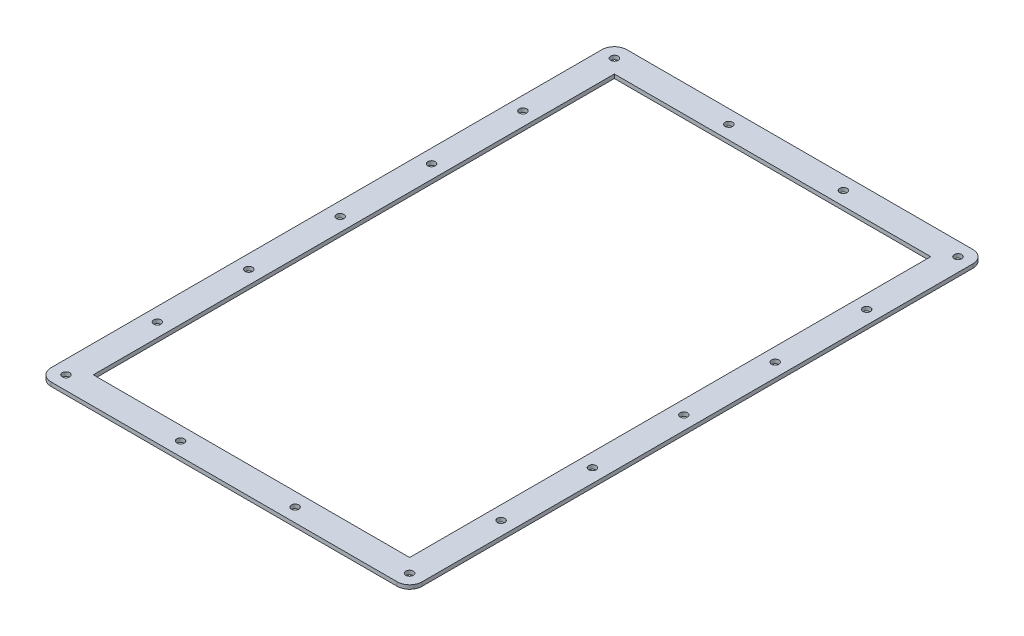
ISO-10303-21;
HEADER;
FILE_DESCRIPTION(('STEP AP214'),'2;1');
FILE_NAME('part.step','',(''),(''),'','','');
FILE_SCHEMA(('AUTOMOTIVE_DESIGN { 1 0 10303 214 1 1 1 1 }'));
ENDSEC;
DATA;
#1=APPLICATION_CONTEXT('core data for automotive mechanical design processes');
#2=APPLICATION_PROTOCOL_DEFINITION('international standard','automotive_design',2000,#1);
#3=PRODUCT_CONTEXT('',#1,'mechanical');
#4=PRODUCT('Part','Part','',(#3));
#5=PRODUCT_RELATED_PRODUCT_CATEGORY('part','',(#4));
#6=PRODUCT_DEFINITION_FORMATION('','',#4);
#7=PRODUCT_DEFINITION_CONTEXT('part definition',#1,'design');
#8=PRODUCT_DEFINITION('design','',#6,#7);
#9=PRODUCT_DEFINITION_SHAPE('','',#8);
#10=(LENGTH_UNIT() NAMED_UNIT(*) SI_UNIT(.MILLI.,.METRE.));
#11=(NAMED_UNIT(*) PLANE_ANGLE_UNIT() SI_UNIT($,.RADIAN.));
#12=(NAMED_UNIT(*) SI_UNIT($,.STERADIAN.) SOLID_ANGLE_UNIT());
#13=UNCERTAINTY_MEASURE_WITH_UNIT(LENGTH_MEASURE(1.E-05),#10,'distance_accuracy_value','');
#14=(GEOMETRIC_REPRESENTATION_CONTEXT(3) GLOBAL_UNCERTAINTY_ASSIGNED_CONTEXT((#13)) GLOBAL_UNIT_ASSIGNED_CONTEXT((#10,
#11,#12)) REPRESENTATION_CONTEXT('',''));
#15=CARTESIAN_POINT('',(0.,0.,0.));
#16=DIRECTION('',(0.,0.,1.));
#17=DIRECTION('',(1.,0.,0.));
#18=AXIS2_PLACEMENT_3D('',#15,#16,#17);
#19=CARTESIAN_POINT('',(130.,3.175,0.));
#20=DIRECTION('',(-1.,0.,0.));
#21=DIRECTION('',(0.,0.,1.));
#22=AXIS2_PLACEMENT_3D('',#19,#20,#21);
#23=PLANE('',#22);
#24=DIRECTION('',(0.,0.,-1.));
#25=VECTOR('',#24,1.);
#26=CARTESIAN_POINT('',(130.,0.,0.));
#27=LINE('',#26,#25);
#28=CARTESIAN_POINT('',(130.,0.,250.));
#29=VERTEX_POINT('',#28);
#30=CARTESIAN_POINT('',(130.,0.,-170.));
#31=VERTEX_POINT('',#30);
#32=EDGE_CURVE('E129',#29,#31,#27,.T.);
#33=ORIENTED_EDGE('',*,*,#32,.F.);
#34=DIRECTION('',(0.,-1.,0.));
#35=VECTOR('',#34,1.);
#36=CARTESIAN_POINT('',(130.,3.175,250.));
#37=LINE('',#36,#35);
#38=CARTESIAN_POINT('',(130.,3.175,250.));
#39=VERTEX_POINT('',#38);
#40=EDGE_CURVE('E125',#39,#29,#37,.T.);
#41=ORIENTED_EDGE('',*,*,#40,.F.);
#42=DIRECTION('',(0.,0.,-1.));
#43=VECTOR('',#42,1.);
#44=CARTESIAN_POINT('',(130.,3.175,0.));
#45=LINE('',#44,#43);
#46=CARTESIAN_POINT('',(130.,3.175,-170.));
#47=VERTEX_POINT('',#46);
#48=EDGE_CURVE('E127',#39,#47,#45,.T.);
#49=ORIENTED_EDGE('',*,*,#48,.T.);
#50=DIRECTION('',(0.,-1.,0.));
#51=VECTOR('',#50,1.);
#52=CARTESIAN_POINT('',(130.,3.175,-170.));
#53=LINE('',#52,#51);
#54=EDGE_CURVE('E154',#47,#31,#53,.T.);
#55=ORIENTED_EDGE('',*,*,#54,.T.);
#56=EDGE_LOOP('',(#33,#41,#49,#55));
#57=FACE_BOUND('',#56,.T.);
#58=ADVANCED_FACE('F35',(#57),#23,.T.);
#59=CARTESIAN_POINT('',(0.,3.175,250.));
#60=DIRECTION('',(0.,0.,-1.));
#61=DIRECTION('',(-1.,0.,0.));
#62=AXIS2_PLACEMENT_3D('',#59,#60,#61);
#63=PLANE('',#62);
#64=DIRECTION('',(1.,0.,0.));
#65=VECTOR('',#64,1.);
#66=CARTESIAN_POINT('',(0.,0.,250.));
#67=LINE('',#66,#65);
#68=CARTESIAN_POINT('',(-125.,0.,250.));
#69=VERTEX_POINT('',#68);
#70=EDGE_CURVE('E222',#69,#29,#67,.T.);
#71=ORIENTED_EDGE('',*,*,#70,.F.);
#72=DIRECTION('',(0.,-1.,0.));
#73=VECTOR('',#72,1.);
#74=CARTESIAN_POINT('',(-125.,3.175,250.));
#75=LINE('',#74,#73);
#76=CARTESIAN_POINT('',(-125.,3.175,250.));
#77=VERTEX_POINT('',#76);
#78=EDGE_CURVE('E135',#77,#69,#75,.T.);
#79=ORIENTED_EDGE('',*,*,#78,.F.);
#80=DIRECTION('',(1.,0.,0.));
#81=VECTOR('',#80,1.);
#82=CARTESIAN_POINT('',(0.,3.175,250.));
#83=LINE('',#82,#81);
#84=EDGE_CURVE('E141',#77,#39,#83,.T.);
#85=ORIENTED_EDGE('',*,*,#84,.T.);
#86=ORIENTED_EDGE('',*,*,#40,.T.);
#87=EDGE_LOOP('',(#71,#79,#85,#86));
#88=FACE_BOUND('',#87,.T.);
#89=ADVANCED_FACE('F146',(#88),#63,.T.);
#90=CARTESIAN_POINT('',(-125.,3.175,0.));
#91=DIRECTION('',(-1.,0.,0.));
#92=DIRECTION('',(0.,0.,1.));
#93=AXIS2_PLACEMENT_3D('',#90,#91,#92);
#94=PLANE('',#93);
#95=DIRECTION('',(0.,0.,-1.));
#96=VECTOR('',#95,1.);
#97=CARTESIAN_POINT('',(-125.,0.,0.));
#98=LINE('',#97,#96);
#99=CARTESIAN_POINT('',(-125.,0.,-170.));
#100=VERTEX_POINT('',#99);
#101=EDGE_CURVE('E224',#69,#100,#98,.T.);
#102=ORIENTED_EDGE('',*,*,#101,.T.);
#103=DIRECTION('',(0.,-1.,0.));
#104=VECTOR('',#103,1.);
#105=CARTESIAN_POINT('',(-125.,3.175,-170.));
#106=LINE('',#105,#104);
#107=CARTESIAN_POINT('',(-125.,3.175,-170.));
#108=VERTEX_POINT('',#107);
#109=EDGE_CURVE('E232',#108,#100,#106,.T.);
#110=ORIENTED_EDGE('',*,*,#109,.F.);
#111=DIRECTION('',(0.,0.,-1.));
#112=VECTOR('',#111,1.);
#113=CARTESIAN_POINT('',(-125.,3.175,0.));
#114=LINE('',#113,#112);
#115=EDGE_CURVE('E148',#77,#108,#114,.T.);
#116=ORIENTED_EDGE('',*,*,#115,.F.);
#117=ORIENTED_EDGE('',*,*,#78,.T.);
#118=EDGE_LOOP('',(#102,#110,#116,#117));
#119=FACE_BOUND('',#118,.T.);
#120=ADVANCED_FACE('F418',(#119),#94,.F.);
#121=CARTESIAN_POINT('',(-147.,3.175,0.));
#122=DIRECTION('',(-1.,0.,0.));
#123=DIRECTION('',(0.,0.,1.));
#124=AXIS2_PLACEMENT_3D('',#121,#122,#123);
#125=PLANE('',#124);
#126=DIRECTION('',(0.,0.,-1.));
#127=VECTOR('',#126,1.);
#128=CARTESIAN_POINT('',(-147.,0.,0.));
#129=LINE('',#128,#127);
#130=CARTESIAN_POINT('',(-147.,0.,262.));
#131=VERTEX_POINT('',#130);
#132=CARTESIAN_POINT('',(-147.,0.,-182.));
#133=VERTEX_POINT('',#132);
#134=EDGE_CURVE('E209',#131,#133,#129,.T.);
#135=ORIENTED_EDGE('',*,*,#134,.F.);
#136=DIRECTION('',(0.,-1.,0.));
#137=VECTOR('',#136,1.);
#138=CARTESIAN_POINT('',(-147.,3.175,262.));
#139=LINE('',#138,#137);
#140=CARTESIAN_POINT('',(-147.,3.175,262.));
#141=VERTEX_POINT('',#140);
#142=EDGE_CURVE('E263',#131,#141,#139,.F.);
#143=ORIENTED_EDGE('',*,*,#142,.T.);
#144=DIRECTION('',(0.,0.,-1.));
#145=VECTOR('',#144,1.);
#146=CARTESIAN_POINT('',(-147.,3.175,0.));
#147=LINE('',#146,#145);
#148=CARTESIAN_POINT('',(-147.,3.175,-182.));
#149=VERTEX_POINT('',#148);
#150=EDGE_CURVE('E270',#141,#149,#147,.T.);
#151=ORIENTED_EDGE('',*,*,#150,.T.);
#152=DIRECTION('',(0.,-1.,0.));
#153=VECTOR('',#152,1.);
#154=CARTESIAN_POINT('',(-147.,3.175,-182.));
#155=LINE('',#154,#153);
#156=EDGE_CURVE('E260',#149,#133,#155,.T.);
#157=ORIENTED_EDGE('',*,*,#156,.T.);
#158=EDGE_LOOP('',(#135,#143,#151,#157));
#159=FACE_BOUND('',#158,.T.);
#160=ADVANCED_FACE('F269',(#159),#125,.T.);
#161=CARTESIAN_POINT('',(-1.51495315734804E-13,3.175,272.));
#162=DIRECTION('',(0.,0.,-1.));
#163=DIRECTION('',(-1.,0.,0.));
#164=AXIS2_PLACEMENT_3D('',#161,#162,#163);
#165=PLANE('',#164);
#166=DIRECTION('',(1.,0.,0.));
#167=VECTOR('',#166,1.);
#168=CARTESIAN_POINT('',(-1.51495315734804E-13,0.,272.));
#169=LINE('',#168,#167);
#170=CARTESIAN_POINT('',(-137.,0.,272.));
#171=VERTEX_POINT('',#170);
#172=CARTESIAN_POINT('',(142.,0.,272.));
#173=VERTEX_POINT('',#172);
#174=EDGE_CURVE('E212',#171,#173,#169,.T.);
#175=ORIENTED_EDGE('',*,*,#174,.T.);
#176=DIRECTION('',(0.,-1.,0.));
#177=VECTOR('',#176,1.);
#178=CARTESIAN_POINT('',(142.,3.175,272.));
#179=LINE('',#178,#177);
#180=CARTESIAN_POINT('',(142.,3.175,272.));
#181=VERTEX_POINT('',#180);
#182=EDGE_CURVE('E251',#173,#181,#179,.F.);
#183=ORIENTED_EDGE('',*,*,#182,.T.);
#184=DIRECTION('',(1.,0.,0.));
#185=VECTOR('',#184,1.);
#186=CARTESIAN_POINT('',(-1.51495315734804E-13,3.175,272.));
#187=LINE('',#186,#185);
#188=CARTESIAN_POINT('',(-137.,3.175,272.));
#189=VERTEX_POINT('',#188);
#190=EDGE_CURVE('E277',#189,#181,#187,.T.);
#191=ORIENTED_EDGE('',*,*,#190,.F.);
#192=DIRECTION('',(0.,-1.,0.));
#193=VECTOR('',#192,1.);
#194=CARTESIAN_POINT('',(-137.,0.,272.));
#195=LINE('',#194,#193);
#196=EDGE_CURVE('E248',#189,#171,#195,.T.);
#197=ORIENTED_EDGE('',*,*,#196,.T.);
#198=EDGE_LOOP('',(#175,#183,#191,#197));
#199=FACE_BOUND('',#198,.T.);
#200=ADVANCED_FACE('F284',(#199),#165,.F.);
#201=CARTESIAN_POINT('',(152.,3.175,0.));
#202=DIRECTION('',(-1.,0.,0.));
#203=DIRECTION('',(0.,0.,1.));
#204=AXIS2_PLACEMENT_3D('',#201,#202,#203);
#205=PLANE('',#204);
#206=DIRECTION('',(0.,0.,-1.));
#207=VECTOR('',#206,1.);
#208=CARTESIAN_POINT('',(152.,3.175,0.));
#209=LINE('',#208,#207);
#210=CARTESIAN_POINT('',(152.,3.175,262.));
#211=VERTEX_POINT('',#210);
#212=CARTESIAN_POINT('',(152.,3.175,-182.));
#213=VERTEX_POINT('',#212);
#214=EDGE_CURVE('E298',#211,#213,#209,.T.);
#215=ORIENTED_EDGE('',*,*,#214,.F.);
#216=DIRECTION('',(0.,-1.,0.));
#217=VECTOR('',#216,1.);
#218=CARTESIAN_POINT('',(152.,3.175,262.));
#219=LINE('',#218,#217);
#220=CARTESIAN_POINT('',(152.,0.,262.));
#221=VERTEX_POINT('',#220);
#222=EDGE_CURVE('E237',#211,#221,#219,.T.);
#223=ORIENTED_EDGE('',*,*,#222,.T.);
#224=DIRECTION('',(0.,0.,-1.));
#225=VECTOR('',#224,1.);
#226=CARTESIAN_POINT('',(152.,0.,0.));
#227=LINE('',#226,#225);
#228=CARTESIAN_POINT('',(152.,0.,-182.));
#229=VERTEX_POINT('',#228);
#230=EDGE_CURVE('E215',#221,#229,#227,.T.);
#231=ORIENTED_EDGE('',*,*,#230,.T.);
#232=DIRECTION('',(0.,-1.,0.));
#233=VECTOR('',#232,1.);
#234=CARTESIAN_POINT('',(152.,3.175,-182.));
#235=LINE('',#234,#233);
#236=EDGE_CURVE('E134',#229,#213,#235,.F.);
#237=ORIENTED_EDGE('',*,*,#236,.T.);
#238=EDGE_LOOP('',(#215,#223,#231,#237));
#239=FACE_BOUND('',#238,.T.);
#240=ADVANCED_FACE('F296',(#239),#205,.F.);
#241=CARTESIAN_POINT('',(0.,3.175,-192.));
#242=DIRECTION('',(0.,0.,-1.));
#243=DIRECTION('',(-1.,0.,0.));
#244=AXIS2_PLACEMENT_3D('',#241,#242,#243);
#245=PLANE('',#244);
#246=DIRECTION('',(1.,0.,0.));
#247=VECTOR('',#246,1.);
#248=CARTESIAN_POINT('',(0.,3.175,-192.));
#249=LINE('',#248,#247);
#250=CARTESIAN_POINT('',(-137.,3.175,-192.));
#251=VERTEX_POINT('',#250);
#252=CARTESIAN_POINT('',(142.,3.175,-192.));
#253=VERTEX_POINT('',#252);
#254=EDGE_CURVE('E144',#251,#253,#249,.T.);
#255=ORIENTED_EDGE('',*,*,#254,.T.);
#256=DIRECTION('',(0.,-1.,0.));
#257=VECTOR('',#256,1.);
#258=CARTESIAN_POINT('',(142.,0.,-192.));
#259=LINE('',#258,#257);
#260=CARTESIAN_POINT('',(142.,0.,-192.));
#261=VERTEX_POINT('',#260);
#262=EDGE_CURVE('E11',#253,#261,#259,.T.);
#263=ORIENTED_EDGE('',*,*,#262,.T.);
#264=DIRECTION('',(1.,0.,0.));
#265=VECTOR('',#264,1.);
#266=CARTESIAN_POINT('',(0.,0.,-192.));
#267=LINE('',#266,#265);
#268=CARTESIAN_POINT('',(-137.,0.,-192.));
#269=VERTEX_POINT('',#268);
#270=EDGE_CURVE('E218',#269,#261,#267,.T.);
#271=ORIENTED_EDGE('',*,*,#270,.F.);
#272=DIRECTION('',(0.,-1.,0.));
#273=VECTOR('',#272,1.);
#274=CARTESIAN_POINT('',(-137.,3.175,-192.));
#275=LINE('',#274,#273);
#276=EDGE_CURVE('E43',#269,#251,#275,.F.);
#277=ORIENTED_EDGE('',*,*,#276,.T.);
#278=EDGE_LOOP('',(#255,#263,#271,#277));
#279=FACE_BOUND('',#278,.T.);
#280=ADVANCED_FACE('F400',(#279),#245,.T.);
#281=CARTESIAN_POINT('',(141.,3.175,-181.));
#282=DIRECTION('',(0.,-1.,0.));
#283=DIRECTION('',(0.,0.,-1.));
#284=AXIS2_PLACEMENT_3D('',#281,#282,#283);
#285=CYLINDRICAL_SURFACE('',#284,2.99999999999999);
#286=CARTESIAN_POINT('',(141.,3.175,-181.));
#287=DIRECTION('',(0.,1.,0.));
#288=DIRECTION('',(0.,0.,1.));
#289=AXIS2_PLACEMENT_3D('',#286,#287,#288);
#290=CIRCLE('',#289,2.99999999999999);
#291=CARTESIAN_POINT('',(141.,3.175,-178.));
#292=VERTEX_POINT('',#291);
#293=EDGE_CURVE('E278',#292,#292,#290,.T.);
#294=ORIENTED_EDGE('',*,*,#293,.T.);
#295=EDGE_LOOP('',(#294));
#296=FACE_BOUND('',#295,.T.);
#297=CARTESIAN_POINT('',(141.,0.,-181.));
#298=DIRECTION('',(0.,1.,0.));
#299=DIRECTION('',(0.,0.,1.));
#300=AXIS2_PLACEMENT_3D('',#297,#298,#299);
#301=CIRCLE('',#300,2.99999999999999);
#302=CARTESIAN_POINT('',(141.,0.,-178.));
#303=VERTEX_POINT('',#302);
#304=EDGE_CURVE('E206',#303,#303,#301,.T.);
#305=ORIENTED_EDGE('',*,*,#304,.F.);
#306=EDGE_LOOP('',(#305));
#307=FACE_BOUND('',#306,.T.);
#308=ADVANCED_FACE('F396',(#296,#307),#285,.F.);
#309=CARTESIAN_POINT('',(48.6666666666667,3.175,-180.999999999995));
#310=DIRECTION('',(0.,-1.,0.));
#311=DIRECTION('',(0.,0.,-1.));
#312=AXIS2_PLACEMENT_3D('',#309,#310,#311);
#313=CYLINDRICAL_SURFACE('',#312,3.);
#314=CARTESIAN_POINT('',(48.6666666666667,3.175,-180.999999999995));
#315=DIRECTION('',(0.,1.,0.));
#316=DIRECTION('',(0.,0.,1.));
#317=AXIS2_PLACEMENT_3D('',#314,#315,#316);
#318=CIRCLE('',#317,3.);
#319=CARTESIAN_POINT('',(48.6666666666667,3.175,-177.999999999995));
#320=VERTEX_POINT('',#319);
#321=EDGE_CURVE('E304',#320,#320,#318,.T.);
#322=ORIENTED_EDGE('',*,*,#321,.T.);
#323=EDGE_LOOP('',(#322));
#324=FACE_BOUND('',#323,.T.);
#325=CARTESIAN_POINT('',(48.6666666666667,0.,-180.999999999995));
#326=DIRECTION('',(0.,1.,0.));
#327=DIRECTION('',(0.,0.,1.));
#328=AXIS2_PLACEMENT_3D('',#325,#326,#327);
#329=CIRCLE('',#328,3.);
#330=CARTESIAN_POINT('',(48.6666666666667,0.,-177.999999999995));
#331=VERTEX_POINT('',#330);
#332=EDGE_CURVE('E203',#331,#331,#329,.T.);
#333=ORIENTED_EDGE('',*,*,#332,.F.);
#334=EDGE_LOOP('',(#333));
#335=FACE_BOUND('',#334,.T.);
#336=ADVANCED_FACE('F399',(#324,#335),#313,.F.);
#337=CARTESIAN_POINT('',(-43.6666666666667,3.175,-180.999999999991));
#338=DIRECTION('',(0.,-1.,0.));
#339=DIRECTION('',(0.,0.,-1.));
#340=AXIS2_PLACEMENT_3D('',#337,#338,#339);
#341=CYLINDRICAL_SURFACE('',#340,3.);
#342=CARTESIAN_POINT('',(-43.6666666666667,3.175,-180.999999999991));
#343=DIRECTION('',(0.,1.,0.));
#344=DIRECTION('',(0.,0.,1.));
#345=AXIS2_PLACEMENT_3D('',#342,#343,#344);
#346=CIRCLE('',#345,3.);
#347=CARTESIAN_POINT('',(-43.6666666666667,3.175,-177.999999999991));
#348=VERTEX_POINT('',#347);
#349=EDGE_CURVE('E307',#348,#348,#346,.T.);
#350=ORIENTED_EDGE('',*,*,#349,.T.);
#351=EDGE_LOOP('',(#350));
#352=FACE_BOUND('',#351,.T.);
#353=CARTESIAN_POINT('',(-43.6666666666667,0.,-180.999999999991));
#354=DIRECTION('',(0.,1.,0.));
#355=DIRECTION('',(0.,0.,1.));
#356=AXIS2_PLACEMENT_3D('',#353,#354,#355);
#357=CIRCLE('',#356,3.);
#358=CARTESIAN_POINT('',(-43.6666666666667,0.,-177.999999999991));
#359=VERTEX_POINT('',#358);
#360=EDGE_CURVE('E200',#359,#359,#357,.T.);
#361=ORIENTED_EDGE('',*,*,#360,.F.);
#362=EDGE_LOOP('',(#361));
#363=FACE_BOUND('',#362,.T.);
#364=ADVANCED_FACE('F432',(#352,#363),#341,.F.);
#365=CARTESIAN_POINT('',(-136.,3.175,-180.999999999987));
#366=DIRECTION('',(0.,-1.,0.));
#367=DIRECTION('',(0.,0.,-1.));
#368=AXIS2_PLACEMENT_3D('',#365,#366,#367);
#369=CYLINDRICAL_SURFACE('',#368,2.99999999999999);
#370=CARTESIAN_POINT('',(-136.,3.175,-180.999999999987));
#371=DIRECTION('',(0.,1.,0.));
#372=DIRECTION('',(0.,0.,1.));
#373=AXIS2_PLACEMENT_3D('',#370,#371,#372);
#374=CIRCLE('',#373,2.99999999999999);
#375=CARTESIAN_POINT('',(-136.,3.175,-177.999999999987));
#376=VERTEX_POINT('',#375);
#377=EDGE_CURVE('E310',#376,#376,#374,.T.);
#378=ORIENTED_EDGE('',*,*,#377,.T.);
#379=EDGE_LOOP('',(#378));
#380=FACE_BOUND('',#379,.T.);
#381=CARTESIAN_POINT('',(-136.,0.,-180.999999999987));
#382=DIRECTION('',(0.,1.,0.));
#383=DIRECTION('',(0.,0.,1.));
#384=AXIS2_PLACEMENT_3D('',#381,#382,#383);
#385=CIRCLE('',#384,2.99999999999999);
#386=CARTESIAN_POINT('',(-136.,0.,-177.999999999987));
#387=VERTEX_POINT('',#386);
#388=EDGE_CURVE('E197',#387,#387,#385,.T.);
#389=ORIENTED_EDGE('',*,*,#388,.F.);
#390=EDGE_LOOP('',(#389));
#391=FACE_BOUND('',#390,.T.);
#392=ADVANCED_FACE('F436',(#380,#391),#369,.F.);
#393=CARTESIAN_POINT('',(141.000000000004,3.175,-107.333333333333));
#394=DIRECTION('',(0.,-1.,0.));
#395=DIRECTION('',(0.,0.,-1.));
#396=AXIS2_PLACEMENT_3D('',#393,#394,#395);
#397=CYLINDRICAL_SURFACE('',#396,2.99999999999999);
#398=CARTESIAN_POINT('',(141.000000000004,3.175,-107.333333333333));
#399=DIRECTION('',(0.,1.,0.));
#400=DIRECTION('',(0.,0.,1.));
#401=AXIS2_PLACEMENT_3D('',#398,#399,#400);
#402=CIRCLE('',#401,2.99999999999999);
#403=CARTESIAN_POINT('',(141.000000000004,3.175,-104.333333333333));
#404=VERTEX_POINT('',#403);
#405=EDGE_CURVE('E313',#404,#404,#402,.T.);
#406=ORIENTED_EDGE('',*,*,#405,.T.);
#407=EDGE_LOOP('',(#406));
#408=FACE_BOUND('',#407,.T.);
#409=CARTESIAN_POINT('',(141.000000000004,0.,-107.333333333333));
#410=DIRECTION('',(0.,1.,0.));
#411=DIRECTION('',(0.,0.,1.));
#412=AXIS2_PLACEMENT_3D('',#409,#410,#411);
#413=CIRCLE('',#412,2.99999999999999);
#414=CARTESIAN_POINT('',(141.000000000004,0.,-104.333333333333));
#415=VERTEX_POINT('',#414);
#416=EDGE_CURVE('E194',#415,#415,#413,.T.);
#417=ORIENTED_EDGE('',*,*,#416,.F.);
#418=EDGE_LOOP('',(#417));
#419=FACE_BOUND('',#418,.T.);
#420=ADVANCED_FACE('F440',(#408,#419),#397,.F.);
#421=CARTESIAN_POINT('',(141.000000000008,3.175,-33.6666666666666));
#422=DIRECTION('',(0.,-1.,0.));
#423=DIRECTION('',(0.,0.,-1.));
#424=AXIS2_PLACEMENT_3D('',#421,#422,#423);
#425=CYLINDRICAL_SURFACE('',#424,2.99999999999999);
#426=CARTESIAN_POINT('',(141.000000000008,3.175,-33.6666666666666));
#427=DIRECTION('',(0.,1.,0.));
#428=DIRECTION('',(0.,0.,1.));
#429=AXIS2_PLACEMENT_3D('',#426,#427,#428);
#430=CIRCLE('',#429,2.99999999999999);
#431=CARTESIAN_POINT('',(141.000000000008,3.175,-30.6666666666666));
#432=VERTEX_POINT('',#431);
#433=EDGE_CURVE('E316',#432,#432,#430,.T.);
#434=ORIENTED_EDGE('',*,*,#433,.T.);
#435=EDGE_LOOP('',(#434));
#436=FACE_BOUND('',#435,.T.);
#437=CARTESIAN_POINT('',(141.000000000008,0.,-33.6666666666666));
#438=DIRECTION('',(0.,1.,0.));
#439=DIRECTION('',(0.,0.,1.));
#440=AXIS2_PLACEMENT_3D('',#437,#438,#439);
#441=CIRCLE('',#440,2.99999999999999);
#442=CARTESIAN_POINT('',(141.000000000008,0.,-30.6666666666666));
#443=VERTEX_POINT('',#442);
#444=EDGE_CURVE('E191',#443,#443,#441,.T.);
#445=ORIENTED_EDGE('',*,*,#444,.F.);
#446=EDGE_LOOP('',(#445));
#447=FACE_BOUND('',#446,.T.);
#448=ADVANCED_FACE('F444',(#436,#447),#425,.F.);
#449=CARTESIAN_POINT('',(141.000000000012,3.175,40.0000000000001));
#450=DIRECTION('',(0.,-1.,0.));
#451=DIRECTION('',(0.,0.,-1.));
#452=AXIS2_PLACEMENT_3D('',#449,#450,#451);
#453=CYLINDRICAL_SURFACE('',#452,2.99999999999999);
#454=CARTESIAN_POINT('',(141.000000000012,3.175,40.0000000000001));
#455=DIRECTION('',(0.,1.,0.));
#456=DIRECTION('',(0.,0.,1.));
#457=AXIS2_PLACEMENT_3D('',#454,#455,#456);
#458=CIRCLE('',#457,2.99999999999999);
#459=CARTESIAN_POINT('',(141.000000000012,3.175,43.0000000000001));
#460=VERTEX_POINT('',#459);
#461=EDGE_CURVE('E319',#460,#460,#458,.T.);
#462=ORIENTED_EDGE('',*,*,#461,.T.);
#463=EDGE_LOOP('',(#462));
#464=FACE_BOUND('',#463,.T.);
#465=CARTESIAN_POINT('',(141.000000000012,0.,40.0000000000001));
#466=DIRECTION('',(0.,1.,0.));
#467=DIRECTION('',(0.,0.,1.));
#468=AXIS2_PLACEMENT_3D('',#465,#466,#467);
#469=CIRCLE('',#468,2.99999999999999);
#470=CARTESIAN_POINT('',(141.000000000012,0.,43.0000000000001));
#471=VERTEX_POINT('',#470);
#472=EDGE_CURVE('E188',#471,#471,#469,.T.);
#473=ORIENTED_EDGE('',*,*,#472,.F.);
#474=EDGE_LOOP('',(#473));
#475=FACE_BOUND('',#474,.T.);
#476=ADVANCED_FACE('F448',(#464,#475),#453,.F.);
#477=CARTESIAN_POINT('',(141.000000000016,3.175,113.666666666667));
#478=DIRECTION('',(0.,-1.,0.));
#479=DIRECTION('',(0.,0.,-1.));
#480=AXIS2_PLACEMENT_3D('',#477,#478,#479);
#481=CYLINDRICAL_SURFACE('',#480,2.99999999999999);
#482=CARTESIAN_POINT('',(141.000000000016,3.175,113.666666666667));
#483=DIRECTION('',(0.,1.,0.));
#484=DIRECTION('',(0.,0.,1.));
#485=AXIS2_PLACEMENT_3D('',#482,#483,#484);
#486=CIRCLE('',#485,2.99999999999999);
#487=CARTESIAN_POINT('',(141.000000000016,3.175,116.666666666667));
#488=VERTEX_POINT('',#487);
#489=EDGE_CURVE('E322',#488,#488,#486,.T.);
#490=ORIENTED_EDGE('',*,*,#489,.T.);
#491=EDGE_LOOP('',(#490));
#492=FACE_BOUND('',#491,.T.);
#493=CARTESIAN_POINT('',(141.000000000016,0.,113.666666666667));
#494=DIRECTION('',(0.,1.,0.));
#495=DIRECTION('',(0.,0.,1.));
#496=AXIS2_PLACEMENT_3D('',#493,#494,#495);
#497=CIRCLE('',#496,2.99999999999999);
#498=CARTESIAN_POINT('',(141.000000000016,0.,116.666666666667));
#499=VERTEX_POINT('',#498);
#500=EDGE_CURVE('E185',#499,#499,#497,.T.);
#501=ORIENTED_EDGE('',*,*,#500,.F.);
#502=EDGE_LOOP('',(#501));
#503=FACE_BOUND('',#502,.T.);
#504=ADVANCED_FACE('F452',(#492,#503),#481,.F.);
#505=CARTESIAN_POINT('',(141.00000000002,3.175,187.333333333333));
#506=DIRECTION('',(0.,-1.,0.));
#507=DIRECTION('',(0.,0.,-1.));
#508=AXIS2_PLACEMENT_3D('',#505,#506,#507);
#509=CYLINDRICAL_SURFACE('',#508,2.99999999999999);
#510=CARTESIAN_POINT('',(141.00000000002,3.175,187.333333333333));
#511=DIRECTION('',(0.,1.,0.));
#512=DIRECTION('',(0.,0.,1.));
#513=AXIS2_PLACEMENT_3D('',#510,#511,#512);
#514=CIRCLE('',#513,2.99999999999999);
#515=CARTESIAN_POINT('',(141.00000000002,3.175,190.333333333333));
#516=VERTEX_POINT('',#515);
#517=EDGE_CURVE('E325',#516,#516,#514,.T.);
#518=ORIENTED_EDGE('',*,*,#517,.T.);
#519=EDGE_LOOP('',(#518));
#520=FACE_BOUND('',#519,.T.);
#521=CARTESIAN_POINT('',(141.00000000002,0.,187.333333333333));
#522=DIRECTION('',(0.,1.,0.));
#523=DIRECTION('',(0.,0.,1.));
#524=AXIS2_PLACEMENT_3D('',#521,#522,#523);
#525=CIRCLE('',#524,2.99999999999999);
#526=CARTESIAN_POINT('',(141.00000000002,0.,190.333333333333));
#527=VERTEX_POINT('',#526);
#528=EDGE_CURVE('E182',#527,#527,#525,.T.);
#529=ORIENTED_EDGE('',*,*,#528,.F.);
#530=EDGE_LOOP('',(#529));
#531=FACE_BOUND('',#530,.T.);
#532=ADVANCED_FACE('F456',(#520,#531),#509,.F.);
#533=CARTESIAN_POINT('',(-135.999999999996,3.175,-107.33333333332));
#534=DIRECTION('',(0.,-1.,0.));
#535=DIRECTION('',(0.,0.,-1.));
#536=AXIS2_PLACEMENT_3D('',#533,#534,#535);
#537=CYLINDRICAL_SURFACE('',#536,2.99999999999999);
#538=CARTESIAN_POINT('',(-135.999999999996,3.175,-107.33333333332));
#539=DIRECTION('',(0.,1.,0.));
#540=DIRECTION('',(0.,0.,1.));
#541=AXIS2_PLACEMENT_3D('',#538,#539,#540);
#542=CIRCLE('',#541,2.99999999999999);
#543=CARTESIAN_POINT('',(-135.999999999996,3.175,-104.33333333332));
#544=VERTEX_POINT('',#543);
#545=EDGE_CURVE('E328',#544,#544,#542,.T.);
#546=ORIENTED_EDGE('',*,*,#545,.T.);
#547=EDGE_LOOP('',(#546));
#548=FACE_BOUND('',#547,.T.);
#549=CARTESIAN_POINT('',(-135.999999999996,0.,-107.33333333332));
#550=DIRECTION('',(0.,1.,0.));
#551=DIRECTION('',(0.,0.,1.));
#552=AXIS2_PLACEMENT_3D('',#549,#550,#551);
#553=CIRCLE('',#552,2.99999999999999);
#554=CARTESIAN_POINT('',(-135.999999999996,0.,-104.33333333332));
#555=VERTEX_POINT('',#554);
#556=EDGE_CURVE('E179',#555,#555,#553,.T.);
#557=ORIENTED_EDGE('',*,*,#556,.F.);
#558=EDGE_LOOP('',(#557));
#559=FACE_BOUND('',#558,.T.);
#560=ADVANCED_FACE('F460',(#548,#559),#537,.F.);
#561=CARTESIAN_POINT('',(141.000000000022,3.175,261.));
#562=DIRECTION('',(0.,-1.,0.));
#563=DIRECTION('',(0.,0.,-1.));
#564=AXIS2_PLACEMENT_3D('',#561,#562,#563);
#565=CYLINDRICAL_SURFACE('',#564,3.00000000000518);
#566=CARTESIAN_POINT('',(141.000000000022,3.175,261.));
#567=DIRECTION('',(0.,1.,0.));
#568=DIRECTION('',(0.,0.,1.));
#569=AXIS2_PLACEMENT_3D('',#566,#567,#568);
#570=CIRCLE('',#569,3.00000000000518);
#571=CARTESIAN_POINT('',(141.000000000022,3.175,264.000000000005));
#572=VERTEX_POINT('',#571);
#573=EDGE_CURVE('E331',#572,#572,#570,.T.);
#574=ORIENTED_EDGE('',*,*,#573,.T.);
#575=EDGE_LOOP('',(#574));
#576=FACE_BOUND('',#575,.T.);
#577=CARTESIAN_POINT('',(141.000000000022,0.,261.));
#578=DIRECTION('',(0.,1.,0.));
#579=DIRECTION('',(0.,0.,1.));
#580=AXIS2_PLACEMENT_3D('',#577,#578,#579);
#581=CIRCLE('',#580,3.00000000000518);
#582=CARTESIAN_POINT('',(141.000000000022,0.,264.000000000005));
#583=VERTEX_POINT('',#582);
#584=EDGE_CURVE('E176',#583,#583,#581,.T.);
#585=ORIENTED_EDGE('',*,*,#584,.F.);
#586=EDGE_LOOP('',(#585));
#587=FACE_BOUND('',#586,.T.);
#588=ADVANCED_FACE('F464',(#576,#587),#565,.F.);
#589=CARTESIAN_POINT('',(-135.999999999992,3.175,-33.6666666666532));
#590=DIRECTION('',(0.,-1.,0.));
#591=DIRECTION('',(0.,0.,-1.));
#592=AXIS2_PLACEMENT_3D('',#589,#590,#591);
#593=CYLINDRICAL_SURFACE('',#592,2.99999999999999);
#594=CARTESIAN_POINT('',(-135.999999999992,3.175,-33.6666666666532));
#595=DIRECTION('',(0.,1.,0.));
#596=DIRECTION('',(0.,0.,1.));
#597=AXIS2_PLACEMENT_3D('',#594,#595,#596);
#598=CIRCLE('',#597,2.99999999999999);
#599=CARTESIAN_POINT('',(-135.999999999992,3.175,-30.6666666666532));
#600=VERTEX_POINT('',#599);
#601=EDGE_CURVE('E334',#600,#600,#598,.T.);
#602=ORIENTED_EDGE('',*,*,#601,.T.);
#603=EDGE_LOOP('',(#602));
#604=FACE_BOUND('',#603,.T.);
#605=CARTESIAN_POINT('',(-135.999999999992,0.,-33.6666666666532));
#606=DIRECTION('',(0.,1.,0.));
#607=DIRECTION('',(0.,0.,1.));
#608=AXIS2_PLACEMENT_3D('',#605,#606,#607);
#609=CIRCLE('',#608,2.99999999999999);
#610=CARTESIAN_POINT('',(-135.999999999992,0.,-30.6666666666532));
#611=VERTEX_POINT('',#610);
#612=EDGE_CURVE('E173',#611,#611,#609,.T.);
#613=ORIENTED_EDGE('',*,*,#612,.F.);
#614=EDGE_LOOP('',(#613));
#615=FACE_BOUND('',#614,.T.);
#616=ADVANCED_FACE('F468',(#604,#615),#593,.F.);
#617=CARTESIAN_POINT('',(48.6666666666891,3.175,261.000000000004));
#618=DIRECTION('',(0.,-1.,0.));
#619=DIRECTION('',(0.,0.,-1.));
#620=AXIS2_PLACEMENT_3D('',#617,#618,#619);
#621=CYLINDRICAL_SURFACE('',#620,3.);
#622=CARTESIAN_POINT('',(48.6666666666891,3.175,261.000000000004));
#623=DIRECTION('',(0.,1.,0.));
#624=DIRECTION('',(0.,0.,1.));
#625=AXIS2_PLACEMENT_3D('',#622,#623,#624);
#626=CIRCLE('',#625,3.);
#627=CARTESIAN_POINT('',(48.6666666666891,3.175,264.000000000004));
#628=VERTEX_POINT('',#627);
#629=EDGE_CURVE('E337',#628,#628,#626,.T.);
#630=ORIENTED_EDGE('',*,*,#629,.T.);
#631=EDGE_LOOP('',(#630));
#632=FACE_BOUND('',#631,.T.);
#633=CARTESIAN_POINT('',(48.6666666666891,0.,261.000000000004));
#634=DIRECTION('',(0.,1.,0.));
#635=DIRECTION('',(0.,0.,1.));
#636=AXIS2_PLACEMENT_3D('',#633,#634,#635);
#637=CIRCLE('',#636,3.);
#638=CARTESIAN_POINT('',(48.6666666666891,0.,264.000000000004));
#639=VERTEX_POINT('',#638);
#640=EDGE_CURVE('E170',#639,#639,#637,.T.);
#641=ORIENTED_EDGE('',*,*,#640,.F.);
#642=EDGE_LOOP('',(#641));
#643=FACE_BOUND('',#642,.T.);
#644=ADVANCED_FACE('F472',(#632,#643),#621,.F.);
#645=CARTESIAN_POINT('',(-135.999999999988,3.175,40.0000000000135));
#646=DIRECTION('',(0.,-1.,0.));
#647=DIRECTION('',(0.,0.,-1.));
#648=AXIS2_PLACEMENT_3D('',#645,#646,#647);
#649=CYLINDRICAL_SURFACE('',#648,2.99999999999999);
#650=CARTESIAN_POINT('',(-135.999999999988,3.175,40.0000000000135));
#651=DIRECTION('',(0.,1.,0.));
#652=DIRECTION('',(0.,0.,1.));
#653=AXIS2_PLACEMENT_3D('',#650,#651,#652);
#654=CIRCLE('',#653,2.99999999999999);
#655=CARTESIAN_POINT('',(-135.999999999988,3.175,43.0000000000135));
#656=VERTEX_POINT('',#655);
#657=EDGE_CURVE('E340',#656,#656,#654,.T.);
#658=ORIENTED_EDGE('',*,*,#657,.T.);
#659=EDGE_LOOP('',(#658));
#660=FACE_BOUND('',#659,.T.);
#661=CARTESIAN_POINT('',(-135.999999999988,0.,40.0000000000135));
#662=DIRECTION('',(0.,1.,0.));
#663=DIRECTION('',(0.,0.,1.));
#664=AXIS2_PLACEMENT_3D('',#661,#662,#663);
#665=CIRCLE('',#664,2.99999999999999);
#666=CARTESIAN_POINT('',(-135.999999999988,0.,43.0000000000135));
#667=VERTEX_POINT('',#666);
#668=EDGE_CURVE('E167',#667,#667,#665,.T.);
#669=ORIENTED_EDGE('',*,*,#668,.F.);
#670=EDGE_LOOP('',(#669));
#671=FACE_BOUND('',#670,.T.);
#672=ADVANCED_FACE('F476',(#660,#671),#649,.F.);
#673=CARTESIAN_POINT('',(-43.6666666666443,3.175,261.000000000009));
#674=DIRECTION('',(0.,-1.,0.));
#675=DIRECTION('',(0.,0.,-1.));
#676=AXIS2_PLACEMENT_3D('',#673,#674,#675);
#677=CYLINDRICAL_SURFACE('',#676,3.);
#678=CARTESIAN_POINT('',(-43.6666666666443,3.175,261.000000000009));
#679=DIRECTION('',(0.,1.,0.));
#680=DIRECTION('',(0.,0.,1.));
#681=AXIS2_PLACEMENT_3D('',#678,#679,#680);
#682=CIRCLE('',#681,3.);
#683=CARTESIAN_POINT('',(-43.6666666666443,3.175,264.000000000009));
#684=VERTEX_POINT('',#683);
#685=EDGE_CURVE('E343',#684,#684,#682,.T.);
#686=ORIENTED_EDGE('',*,*,#685,.T.);
#687=EDGE_LOOP('',(#686));
#688=FACE_BOUND('',#687,.T.);
#689=CARTESIAN_POINT('',(-43.6666666666443,0.,261.000000000009));
#690=DIRECTION('',(0.,1.,0.));
#691=DIRECTION('',(0.,0.,1.));
#692=AXIS2_PLACEMENT_3D('',#689,#690,#691);
#693=CIRCLE('',#692,3.);
#694=CARTESIAN_POINT('',(-43.6666666666443,0.,264.000000000009));
#695=VERTEX_POINT('',#694);
#696=EDGE_CURVE('E164',#695,#695,#693,.T.);
#697=ORIENTED_EDGE('',*,*,#696,.F.);
#698=EDGE_LOOP('',(#697));
#699=FACE_BOUND('',#698,.T.);
#700=ADVANCED_FACE('F480',(#688,#699),#677,.F.);
#701=CARTESIAN_POINT('',(-135.999999999984,3.175,113.66666666668));
#702=DIRECTION('',(0.,-1.,0.));
#703=DIRECTION('',(0.,0.,-1.));
#704=AXIS2_PLACEMENT_3D('',#701,#702,#703);
#705=CYLINDRICAL_SURFACE('',#704,2.99999999999999);
#706=CARTESIAN_POINT('',(-135.999999999984,3.175,113.66666666668));
#707=DIRECTION('',(0.,1.,0.));
#708=DIRECTION('',(0.,0.,1.));
#709=AXIS2_PLACEMENT_3D('',#706,#707,#708);
#710=CIRCLE('',#709,2.99999999999999);
#711=CARTESIAN_POINT('',(-135.999999999984,3.175,116.66666666668));
#712=VERTEX_POINT('',#711);
#713=EDGE_CURVE('E346',#712,#712,#710,.T.);
#714=ORIENTED_EDGE('',*,*,#713,.T.);
#715=EDGE_LOOP('',(#714));
#716=FACE_BOUND('',#715,.T.);
#717=CARTESIAN_POINT('',(-135.999999999984,0.,113.66666666668));
#718=DIRECTION('',(0.,1.,0.));
#719=DIRECTION('',(0.,0.,1.));
#720=AXIS2_PLACEMENT_3D('',#717,#718,#719);
#721=CIRCLE('',#720,2.99999999999999);
#722=CARTESIAN_POINT('',(-135.999999999984,0.,116.66666666668));
#723=VERTEX_POINT('',#722);
#724=EDGE_CURVE('E161',#723,#723,#721,.T.);
#725=ORIENTED_EDGE('',*,*,#724,.F.);
#726=EDGE_LOOP('',(#725));
#727=FACE_BOUND('',#726,.T.);
#728=ADVANCED_FACE('F484',(#716,#727),#705,.F.);
#729=CARTESIAN_POINT('',(-135.999999999978,3.175,261.000000000013));
#730=DIRECTION('',(0.,-1.,0.));
#731=DIRECTION('',(0.,0.,-1.));
#732=AXIS2_PLACEMENT_3D('',#729,#730,#731);
#733=CYLINDRICAL_SURFACE('',#732,2.99999999999999);
#734=CARTESIAN_POINT('',(-135.999999999978,3.175,261.000000000013));
#735=DIRECTION('',(0.,1.,0.));
#736=DIRECTION('',(0.,0.,1.));
#737=AXIS2_PLACEMENT_3D('',#734,#735,#736);
#738=CIRCLE('',#737,2.99999999999999);
#739=CARTESIAN_POINT('',(-135.999999999978,3.175,264.000000000013));
#740=VERTEX_POINT('',#739);
#741=EDGE_CURVE('E349',#740,#740,#738,.T.);
#742=ORIENTED_EDGE('',*,*,#741,.T.);
#743=EDGE_LOOP('',(#742));
#744=FACE_BOUND('',#743,.T.);
#745=CARTESIAN_POINT('',(-135.999999999978,0.,261.000000000013));
#746=DIRECTION('',(0.,1.,0.));
#747=DIRECTION('',(0.,0.,1.));
#748=AXIS2_PLACEMENT_3D('',#745,#746,#747);
#749=CIRCLE('',#748,2.99999999999999);
#750=CARTESIAN_POINT('',(-135.999999999978,0.,264.000000000013));
#751=VERTEX_POINT('',#750);
#752=EDGE_CURVE('E158',#751,#751,#749,.T.);
#753=ORIENTED_EDGE('',*,*,#752,.F.);
#754=EDGE_LOOP('',(#753));
#755=FACE_BOUND('',#754,.T.);
#756=ADVANCED_FACE('F488',(#744,#755),#733,.F.);
#757=CARTESIAN_POINT('',(-135.99999999998,3.175,187.333333333347));
#758=DIRECTION('',(0.,-1.,0.));
#759=DIRECTION('',(0.,0.,-1.));
#760=AXIS2_PLACEMENT_3D('',#757,#758,#759);
#761=CYLINDRICAL_SURFACE('',#760,2.99999999999999);
#762=CARTESIAN_POINT('',(-135.99999999998,3.175,187.333333333347));
#763=DIRECTION('',(0.,1.,0.));
#764=DIRECTION('',(0.,0.,1.));
#765=AXIS2_PLACEMENT_3D('',#762,#763,#764);
#766=CIRCLE('',#765,2.99999999999999);
#767=CARTESIAN_POINT('',(-135.99999999998,3.175,190.333333333347));
#768=VERTEX_POINT('',#767);
#769=EDGE_CURVE('E230',#768,#768,#766,.T.);
#770=ORIENTED_EDGE('',*,*,#769,.T.);
#771=EDGE_LOOP('',(#770));
#772=FACE_BOUND('',#771,.T.);
#773=CARTESIAN_POINT('',(-135.99999999998,0.,187.333333333347));
#774=DIRECTION('',(0.,1.,0.));
#775=DIRECTION('',(0.,0.,1.));
#776=AXIS2_PLACEMENT_3D('',#773,#774,#775);
#777=CIRCLE('',#776,2.99999999999999);
#778=CARTESIAN_POINT('',(-135.99999999998,0.,190.333333333347));
#779=VERTEX_POINT('',#778);
#780=EDGE_CURVE('E155',#779,#779,#777,.T.);
#781=ORIENTED_EDGE('',*,*,#780,.F.);
#782=EDGE_LOOP('',(#781));
#783=FACE_BOUND('',#782,.T.);
#784=ADVANCED_FACE('F355',(#772,#783),#761,.F.);
#785=CARTESIAN_POINT('',(0.,3.175,-170.));
#786=DIRECTION('',(0.,0.,-1.));
#787=DIRECTION('',(-1.,0.,0.));
#788=AXIS2_PLACEMENT_3D('',#785,#786,#787);
#789=PLANE('',#788);
#790=DIRECTION('',(1.,0.,0.));
#791=VECTOR('',#790,1.);
#792=CARTESIAN_POINT('',(0.,0.,-170.));
#793=LINE('',#792,#791);
#794=EDGE_CURVE('E227',#100,#31,#793,.T.);
#795=ORIENTED_EDGE('',*,*,#794,.T.);
#796=ORIENTED_EDGE('',*,*,#54,.F.);
#797=DIRECTION('',(1.,0.,0.));
#798=VECTOR('',#797,1.);
#799=CARTESIAN_POINT('',(0.,3.175,-170.));
#800=LINE('',#799,#798);
#801=EDGE_CURVE('E142',#108,#47,#800,.T.);
#802=ORIENTED_EDGE('',*,*,#801,.F.);
#803=ORIENTED_EDGE('',*,*,#109,.T.);
#804=EDGE_LOOP('',(#795,#796,#802,#803));
#805=FACE_BOUND('',#804,.T.);
#806=ADVANCED_FACE('F360',(#805),#789,.F.);
#807=CARTESIAN_POINT('',(0.,3.175,0.));
#808=DIRECTION('',(0.,1.,0.));
#809=DIRECTION('',(0.,0.,1.));
#810=AXIS2_PLACEMENT_3D('',#807,#808,#809);
#811=PLANE('',#810);
#812=ORIENTED_EDGE('',*,*,#769,.F.);
#813=EDGE_LOOP('',(#812));
#814=FACE_BOUND('',#813,.T.);
#815=ORIENTED_EDGE('',*,*,#741,.F.);
#816=EDGE_LOOP('',(#815));
#817=FACE_BOUND('',#816,.T.);
#818=ORIENTED_EDGE('',*,*,#713,.F.);
#819=EDGE_LOOP('',(#818));
#820=FACE_BOUND('',#819,.T.);
#821=ORIENTED_EDGE('',*,*,#685,.F.);
#822=EDGE_LOOP('',(#821));
#823=FACE_BOUND('',#822,.T.);
#824=ORIENTED_EDGE('',*,*,#657,.F.);
#825=EDGE_LOOP('',(#824));
#826=FACE_BOUND('',#825,.T.);
#827=ORIENTED_EDGE('',*,*,#629,.F.);
#828=EDGE_LOOP('',(#827));
#829=FACE_BOUND('',#828,.T.);
#830=ORIENTED_EDGE('',*,*,#601,.F.);
#831=EDGE_LOOP('',(#830));
#832=FACE_BOUND('',#831,.T.);
#833=ORIENTED_EDGE('',*,*,#573,.F.);
#834=EDGE_LOOP('',(#833));
#835=FACE_BOUND('',#834,.T.);
#836=ORIENTED_EDGE('',*,*,#545,.F.);
#837=EDGE_LOOP('',(#836));
#838=FACE_BOUND('',#837,.T.);
#839=ORIENTED_EDGE('',*,*,#517,.F.);
#840=EDGE_LOOP('',(#839));
#841=FACE_BOUND('',#840,.T.);
#842=ORIENTED_EDGE('',*,*,#489,.F.);
#843=EDGE_LOOP('',(#842));
#844=FACE_BOUND('',#843,.T.);
#845=ORIENTED_EDGE('',*,*,#461,.F.);
#846=EDGE_LOOP('',(#845));
#847=FACE_BOUND('',#846,.T.);
#848=ORIENTED_EDGE('',*,*,#433,.F.);
#849=EDGE_LOOP('',(#848));
#850=FACE_BOUND('',#849,.T.);
#851=ORIENTED_EDGE('',*,*,#405,.F.);
#852=EDGE_LOOP('',(#851));
#853=FACE_BOUND('',#852,.T.);
#854=ORIENTED_EDGE('',*,*,#377,.F.);
#855=EDGE_LOOP('',(#854));
#856=FACE_BOUND('',#855,.T.);
#857=ORIENTED_EDGE('',*,*,#349,.F.);
#858=EDGE_LOOP('',(#857));
#859=FACE_BOUND('',#858,.T.);
#860=ORIENTED_EDGE('',*,*,#321,.F.);
#861=EDGE_LOOP('',(#860));
#862=FACE_BOUND('',#861,.T.);
#863=ORIENTED_EDGE('',*,*,#293,.F.);
#864=EDGE_LOOP('',(#863));
#865=FACE_BOUND('',#864,.T.);
#866=ORIENTED_EDGE('',*,*,#190,.T.);
#867=CARTESIAN_POINT('',(142.,3.175,262.));
#868=DIRECTION('',(0.,1.,0.));
#869=DIRECTION('',(0.,0.,1.));
#870=AXIS2_PLACEMENT_3D('',#867,#868,#869);
#871=CIRCLE('',#870,10.);
#872=EDGE_CURVE('E258',#181,#211,#871,.T.);
#873=ORIENTED_EDGE('',*,*,#872,.T.);
#874=ORIENTED_EDGE('',*,*,#214,.T.);
#875=CARTESIAN_POINT('',(142.,3.175,-182.));
#876=DIRECTION('',(0.,1.,0.));
#877=DIRECTION('',(0.,0.,1.));
#878=AXIS2_PLACEMENT_3D('',#875,#876,#877);
#879=CIRCLE('',#878,10.);
#880=EDGE_CURVE('E50',#213,#253,#879,.T.);
#881=ORIENTED_EDGE('',*,*,#880,.T.);
#882=ORIENTED_EDGE('',*,*,#254,.F.);
#883=CARTESIAN_POINT('',(-137.,3.175,-182.));
#884=DIRECTION('',(0.,1.,0.));
#885=DIRECTION('',(0.,0.,1.));
#886=AXIS2_PLACEMENT_3D('',#883,#884,#885);
#887=CIRCLE('',#886,10.);
#888=EDGE_CURVE('E253',#251,#149,#887,.T.);
#889=ORIENTED_EDGE('',*,*,#888,.T.);
#890=ORIENTED_EDGE('',*,*,#150,.F.);
#891=CARTESIAN_POINT('',(-137.,3.175,262.));
#892=DIRECTION('',(0.,1.,0.));
#893=DIRECTION('',(0.,0.,1.));
#894=AXIS2_PLACEMENT_3D('',#891,#892,#893);
#895=CIRCLE('',#894,10.);
#896=EDGE_CURVE('E256',#141,#189,#895,.T.);
#897=ORIENTED_EDGE('',*,*,#896,.T.);
#898=EDGE_LOOP('',(#866,#873,#874,#881,#882,#889,#890,#897));
#899=FACE_BOUND('',#898,.T.);
#900=ORIENTED_EDGE('',*,*,#48,.F.);
#901=ORIENTED_EDGE('',*,*,#84,.F.);
#902=ORIENTED_EDGE('',*,*,#115,.T.);
#903=ORIENTED_EDGE('',*,*,#801,.T.);
#904=EDGE_LOOP('',(#900,#901,#902,#903));
#905=FACE_BOUND('',#904,.T.);
#906=ADVANCED_FACE('F139',(#814,#817,#820,#823,#826,#829,#832,#835,#838,#841,#844,#847,#850,
#853,#856,#859,#862,#865,#899,#905),#811,.T.);
#907=CARTESIAN_POINT('',(0.,0.,0.));
#908=DIRECTION('',(0.,1.,0.));
#909=DIRECTION('',(0.,0.,1.));
#910=AXIS2_PLACEMENT_3D('',#907,#908,#909);
#911=PLANE('',#910);
#912=ORIENTED_EDGE('',*,*,#780,.T.);
#913=EDGE_LOOP('',(#912));
#914=FACE_BOUND('',#913,.T.);
#915=ORIENTED_EDGE('',*,*,#752,.T.);
#916=EDGE_LOOP('',(#915));
#917=FACE_BOUND('',#916,.T.);
#918=ORIENTED_EDGE('',*,*,#724,.T.);
#919=EDGE_LOOP('',(#918));
#920=FACE_BOUND('',#919,.T.);
#921=ORIENTED_EDGE('',*,*,#696,.T.);
#922=EDGE_LOOP('',(#921));
#923=FACE_BOUND('',#922,.T.);
#924=ORIENTED_EDGE('',*,*,#668,.T.);
#925=EDGE_LOOP('',(#924));
#926=FACE_BOUND('',#925,.T.);
#927=ORIENTED_EDGE('',*,*,#640,.T.);
#928=EDGE_LOOP('',(#927));
#929=FACE_BOUND('',#928,.T.);
#930=ORIENTED_EDGE('',*,*,#612,.T.);
#931=EDGE_LOOP('',(#930));
#932=FACE_BOUND('',#931,.T.);
#933=ORIENTED_EDGE('',*,*,#584,.T.);
#934=EDGE_LOOP('',(#933));
#935=FACE_BOUND('',#934,.T.);
#936=ORIENTED_EDGE('',*,*,#556,.T.);
#937=EDGE_LOOP('',(#936));
#938=FACE_BOUND('',#937,.T.);
#939=ORIENTED_EDGE('',*,*,#528,.T.);
#940=EDGE_LOOP('',(#939));
#941=FACE_BOUND('',#940,.T.);
#942=ORIENTED_EDGE('',*,*,#500,.T.);
#943=EDGE_LOOP('',(#942));
#944=FACE_BOUND('',#943,.T.);
#945=ORIENTED_EDGE('',*,*,#472,.T.);
#946=EDGE_LOOP('',(#945));
#947=FACE_BOUND('',#946,.T.);
#948=ORIENTED_EDGE('',*,*,#444,.T.);
#949=EDGE_LOOP('',(#948));
#950=FACE_BOUND('',#949,.T.);
#951=ORIENTED_EDGE('',*,*,#416,.T.);
#952=EDGE_LOOP('',(#951));
#953=FACE_BOUND('',#952,.T.);
#954=ORIENTED_EDGE('',*,*,#388,.T.);
#955=EDGE_LOOP('',(#954));
#956=FACE_BOUND('',#955,.T.);
#957=ORIENTED_EDGE('',*,*,#360,.T.);
#958=EDGE_LOOP('',(#957));
#959=FACE_BOUND('',#958,.T.);
#960=ORIENTED_EDGE('',*,*,#332,.T.);
#961=EDGE_LOOP('',(#960));
#962=FACE_BOUND('',#961,.T.);
#963=ORIENTED_EDGE('',*,*,#304,.T.);
#964=EDGE_LOOP('',(#963));
#965=FACE_BOUND('',#964,.T.);
#966=ORIENTED_EDGE('',*,*,#230,.F.);
#967=CARTESIAN_POINT('',(142.,0.,262.));
#968=DIRECTION('',(0.,1.,0.));
#969=DIRECTION('',(0.,0.,1.));
#970=AXIS2_PLACEMENT_3D('',#967,#968,#969);
#971=CIRCLE('',#970,10.);
#972=EDGE_CURVE('E246',#221,#173,#971,.F.);
#973=ORIENTED_EDGE('',*,*,#972,.T.);
#974=ORIENTED_EDGE('',*,*,#174,.F.);
#975=CARTESIAN_POINT('',(-137.,0.,262.));
#976=DIRECTION('',(0.,1.,0.));
#977=DIRECTION('',(0.,0.,1.));
#978=AXIS2_PLACEMENT_3D('',#975,#976,#977);
#979=CIRCLE('',#978,10.);
#980=EDGE_CURVE('E244',#171,#131,#979,.F.);
#981=ORIENTED_EDGE('',*,*,#980,.T.);
#982=ORIENTED_EDGE('',*,*,#134,.T.);
#983=CARTESIAN_POINT('',(-137.,0.,-182.));
#984=DIRECTION('',(0.,1.,0.));
#985=DIRECTION('',(0.,0.,1.));
#986=AXIS2_PLACEMENT_3D('',#983,#984,#985);
#987=CIRCLE('',#986,10.);
#988=EDGE_CURVE('E240',#133,#269,#987,.F.);
#989=ORIENTED_EDGE('',*,*,#988,.T.);
#990=ORIENTED_EDGE('',*,*,#270,.T.);
#991=CARTESIAN_POINT('',(142.,0.,-182.));
#992=DIRECTION('',(0.,1.,0.));
#993=DIRECTION('',(0.,0.,1.));
#994=AXIS2_PLACEMENT_3D('',#991,#992,#993);
#995=CIRCLE('',#994,10.);
#996=EDGE_CURVE('E242',#261,#229,#995,.F.);
#997=ORIENTED_EDGE('',*,*,#996,.T.);
#998=EDGE_LOOP('',(#966,#973,#974,#981,#982,#989,#990,#997));
#999=FACE_BOUND('',#998,.T.);
#1000=ORIENTED_EDGE('',*,*,#32,.T.);
#1001=ORIENTED_EDGE('',*,*,#794,.F.);
#1002=ORIENTED_EDGE('',*,*,#101,.F.);
#1003=ORIENTED_EDGE('',*,*,#70,.T.);
#1004=EDGE_LOOP('',(#1000,#1001,#1002,#1003));
#1005=FACE_BOUND('',#1004,.T.);
#1006=ADVANCED_FACE('F288',(#914,#917,#920,#923,#926,#929,#932,#935,#938,#941,#944,#947,#950,
#953,#956,#959,#962,#965,#999,#1005),#911,.F.);
#1007=CARTESIAN_POINT('',(142.,3.175,262.));
#1008=DIRECTION('',(0.,-1.,0.));
#1009=DIRECTION('',(0.,0.,-1.));
#1010=AXIS2_PLACEMENT_3D('',#1007,#1008,#1009);
#1011=CYLINDRICAL_SURFACE('',#1010,10.);
#1012=ORIENTED_EDGE('',*,*,#872,.F.);
#1013=ORIENTED_EDGE('',*,*,#182,.F.);
#1014=ORIENTED_EDGE('',*,*,#972,.F.);
#1015=ORIENTED_EDGE('',*,*,#222,.F.);
#1016=EDGE_LOOP('',(#1012,#1013,#1014,#1015));
#1017=FACE_BOUND('',#1016,.T.);
#1018=ADVANCED_FACE('F293',(#1017),#1011,.T.);
#1019=CARTESIAN_POINT('',(-137.,3.175,262.));
#1020=DIRECTION('',(0.,1.,0.));
#1021=DIRECTION('',(0.,0.,1.));
#1022=AXIS2_PLACEMENT_3D('',#1019,#1020,#1021);
#1023=CYLINDRICAL_SURFACE('',#1022,10.);
#1024=ORIENTED_EDGE('',*,*,#896,.F.);
#1025=ORIENTED_EDGE('',*,*,#142,.F.);
#1026=ORIENTED_EDGE('',*,*,#980,.F.);
#1027=ORIENTED_EDGE('',*,*,#196,.F.);
#1028=EDGE_LOOP('',(#1024,#1025,#1026,#1027));
#1029=FACE_BOUND('',#1028,.T.);
#1030=ADVANCED_FACE('F281',(#1029),#1023,.T.);
#1031=CARTESIAN_POINT('',(142.,3.175,-182.));
#1032=DIRECTION('',(0.,1.,0.));
#1033=DIRECTION('',(0.,0.,1.));
#1034=AXIS2_PLACEMENT_3D('',#1031,#1032,#1033);
#1035=CYLINDRICAL_SURFACE('',#1034,10.);
#1036=ORIENTED_EDGE('',*,*,#880,.F.);
#1037=ORIENTED_EDGE('',*,*,#236,.F.);
#1038=ORIENTED_EDGE('',*,*,#996,.F.);
#1039=ORIENTED_EDGE('',*,*,#262,.F.);
#1040=EDGE_LOOP('',(#1036,#1037,#1038,#1039));
#1041=FACE_BOUND('',#1040,.T.);
#1042=ADVANCED_FACE('F496',(#1041),#1035,.T.);
#1043=CARTESIAN_POINT('',(-137.,3.175,-182.));
#1044=DIRECTION('',(0.,-1.,0.));
#1045=DIRECTION('',(0.,0.,-1.));
#1046=AXIS2_PLACEMENT_3D('',#1043,#1044,#1045);
#1047=CYLINDRICAL_SURFACE('',#1046,10.);
#1048=ORIENTED_EDGE('',*,*,#888,.F.);
#1049=ORIENTED_EDGE('',*,*,#276,.F.);
#1050=ORIENTED_EDGE('',*,*,#988,.F.);
#1051=ORIENTED_EDGE('',*,*,#156,.F.);
#1052=EDGE_LOOP('',(#1048,#1049,#1050,#1051));
#1053=FACE_BOUND('',#1052,.T.);
#1054=ADVANCED_FACE('F37',(#1053),#1047,.T.);
#1055=CLOSED_SHELL('',(#58,#89,#120,#160,#200,#240,#280,#308,#336,#364,#392,#420,#448,#476,#504,
#532,#560,#588,#616,#644,#672,#700,#728,#756,#784,#806,#906,#1006,#1018,#1030,#1042,#1054));
#1056=MANIFOLD_SOLID_BREP('B2',#1055);
#1057=ADVANCED_BREP_SHAPE_REPRESENTATION('',(#18,#1056),#14);
#1058=SHAPE_DEFINITION_REPRESENTATION(#9,#1057);
ENDSEC;
END-ISO-10303-21;
